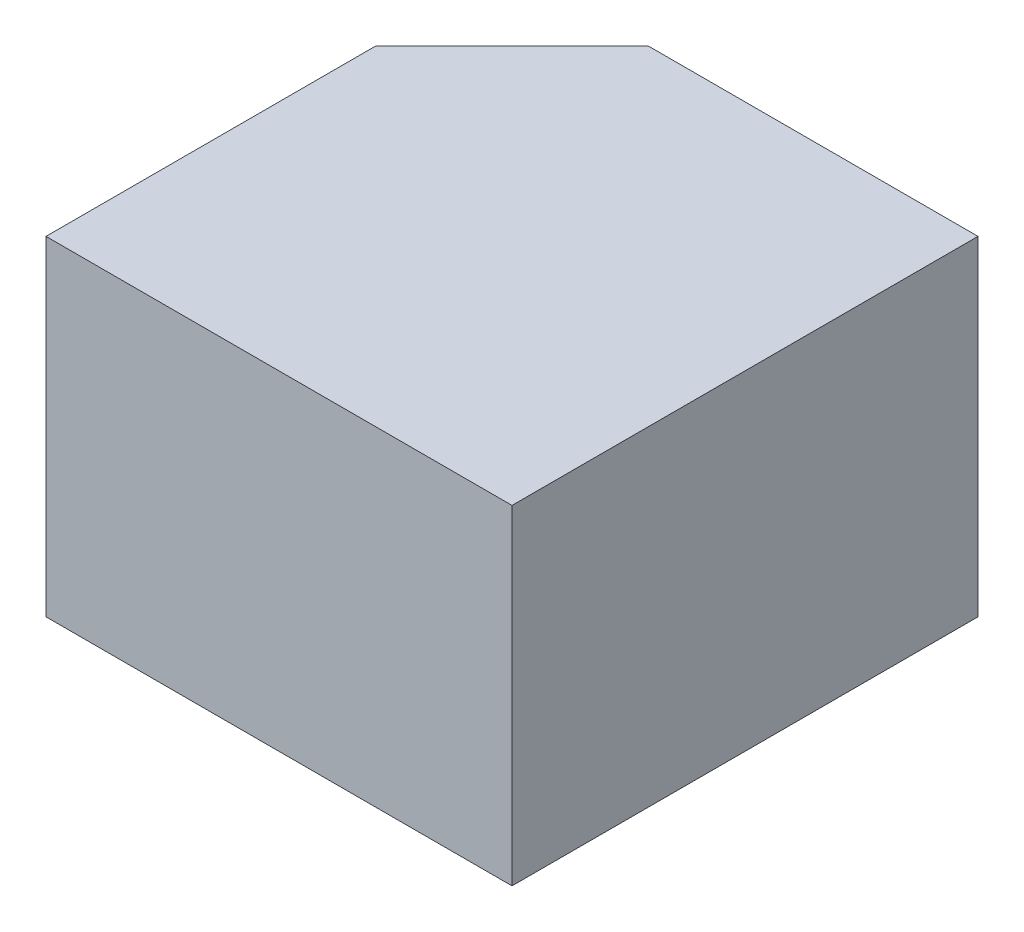
ISO-10303-21;
HEADER;
FILE_DESCRIPTION(('STEP AP214'),'2;1');
FILE_NAME('part.step','',(''),(''),'','','');
FILE_SCHEMA(('AUTOMOTIVE_DESIGN { 1 0 10303 214 1 1 1 1 }'));
ENDSEC;
DATA;
#1=APPLICATION_CONTEXT('core data for automotive mechanical design processes');
#2=APPLICATION_PROTOCOL_DEFINITION('international standard','automotive_design',2000,#1);
#3=PRODUCT_CONTEXT('',#1,'mechanical');
#4=PRODUCT('Part','Part','',(#3));
#5=PRODUCT_RELATED_PRODUCT_CATEGORY('part','',(#4));
#6=PRODUCT_DEFINITION_FORMATION('','',#4);
#7=PRODUCT_DEFINITION_CONTEXT('part definition',#1,'design');
#8=PRODUCT_DEFINITION('design','',#6,#7);
#9=PRODUCT_DEFINITION_SHAPE('','',#8);
#10=(LENGTH_UNIT() NAMED_UNIT(*) SI_UNIT(.MILLI.,.METRE.));
#11=(NAMED_UNIT(*) PLANE_ANGLE_UNIT() SI_UNIT($,.RADIAN.));
#12=(NAMED_UNIT(*) SI_UNIT($,.STERADIAN.) SOLID_ANGLE_UNIT());
#13=UNCERTAINTY_MEASURE_WITH_UNIT(LENGTH_MEASURE(1.E-05),#10,'distance_accuracy_value','');
#14=(GEOMETRIC_REPRESENTATION_CONTEXT(3) GLOBAL_UNCERTAINTY_ASSIGNED_CONTEXT((#13)) GLOBAL_UNIT_ASSIGNED_CONTEXT((#10,
#11,#12)) REPRESENTATION_CONTEXT('',''));
#15=CARTESIAN_POINT('',(0.,0.,0.));
#16=DIRECTION('',(0.,0.,1.));
#17=DIRECTION('',(1.,0.,0.));
#18=AXIS2_PLACEMENT_3D('',#15,#16,#17);
#19=CARTESIAN_POINT('',(21.2132034355964,30.,-21.2132034355964));
#20=DIRECTION('',(0.,0.,1.));
#21=DIRECTION('',(1.,0.,0.));
#22=AXIS2_PLACEMENT_3D('',#19,#20,#21);
#23=PLANE('',#22);
#24=DIRECTION('',(0.,-1.,0.));
#25=VECTOR('',#24,1.);
#26=CARTESIAN_POINT('',(-8.78679656440358,30.,-21.2132034355964));
#27=LINE('',#26,#25);
#28=CARTESIAN_POINT('',(-8.78679656440358,30.,-21.2132034355964));
#29=VERTEX_POINT('',#28);
#30=CARTESIAN_POINT('',(-8.78679656440357,0.,-21.2132034355964));
#31=VERTEX_POINT('',#30);
#32=EDGE_CURVE('E60',#29,#31,#27,.T.);
#33=ORIENTED_EDGE('',*,*,#32,.F.);
#34=DIRECTION('',(-1.,0.,0.));
#35=VECTOR('',#34,1.);
#36=CARTESIAN_POINT('',(21.2132034355964,30.,-21.2132034355964));
#37=LINE('',#36,#35);
#38=CARTESIAN_POINT('',(21.2132034355964,30.,-21.2132034355964));
#39=VERTEX_POINT('',#38);
#40=EDGE_CURVE('E112',#39,#29,#37,.T.);
#41=ORIENTED_EDGE('',*,*,#40,.F.);
#42=DIRECTION('',(0.,-1.,0.));
#43=VECTOR('',#42,1.);
#44=CARTESIAN_POINT('',(21.2132034355964,30.,-21.2132034355964));
#45=LINE('',#44,#43);
#46=CARTESIAN_POINT('',(21.2132034355964,0.,-21.2132034355964));
#47=VERTEX_POINT('',#46);
#48=EDGE_CURVE('E126',#39,#47,#45,.T.);
#49=ORIENTED_EDGE('',*,*,#48,.T.);
#50=DIRECTION('',(-1.,0.,0.));
#51=VECTOR('',#50,1.);
#52=CARTESIAN_POINT('',(21.2132034355964,0.,-21.2132034355964));
#53=LINE('',#52,#51);
#54=EDGE_CURVE('E106',#47,#31,#53,.T.);
#55=ORIENTED_EDGE('',*,*,#54,.T.);
#56=EDGE_LOOP('',(#33,#41,#49,#55));
#57=FACE_BOUND('',#56,.T.);
#58=ADVANCED_FACE('F45',(#57),#23,.F.);
#59=CARTESIAN_POINT('',(-21.2132034355964,30.,21.2132034355964));
#60=DIRECTION('',(-1.,0.,0.));
#61=DIRECTION('',(0.,0.,1.));
#62=AXIS2_PLACEMENT_3D('',#59,#60,#61);
#63=PLANE('',#62);
#64=DIRECTION('',(0.,0.,-1.));
#65=VECTOR('',#64,1.);
#66=CARTESIAN_POINT('',(-21.2132034355964,30.,21.2132034355964));
#67=LINE('',#66,#65);
#68=CARTESIAN_POINT('',(-21.2132034355964,30.,21.2132034355964));
#69=VERTEX_POINT('',#68);
#70=CARTESIAN_POINT('',(-21.2132034355964,30.,-8.78679656440357));
#71=VERTEX_POINT('',#70);
#72=EDGE_CURVE('E109',#69,#71,#67,.T.);
#73=ORIENTED_EDGE('',*,*,#72,.T.);
#74=DIRECTION('',(0.,-1.,0.));
#75=VECTOR('',#74,1.);
#76=CARTESIAN_POINT('',(-21.2132034355964,30.,-8.78679656440357));
#77=LINE('',#76,#75);
#78=CARTESIAN_POINT('',(-21.2132034355964,0.,-8.78679656440357));
#79=VERTEX_POINT('',#78);
#80=EDGE_CURVE('E99',#71,#79,#77,.T.);
#81=ORIENTED_EDGE('',*,*,#80,.T.);
#82=DIRECTION('',(0.,0.,-1.));
#83=VECTOR('',#82,1.);
#84=CARTESIAN_POINT('',(-21.2132034355964,0.,21.2132034355964));
#85=LINE('',#84,#83);
#86=CARTESIAN_POINT('',(-21.2132034355964,0.,21.2132034355964));
#87=VERTEX_POINT('',#86);
#88=EDGE_CURVE('E130',#87,#79,#85,.T.);
#89=ORIENTED_EDGE('',*,*,#88,.F.);
#90=DIRECTION('',(0.,-1.,0.));
#91=VECTOR('',#90,1.);
#92=CARTESIAN_POINT('',(-21.2132034355964,30.,21.2132034355964));
#93=LINE('',#92,#91);
#94=EDGE_CURVE('E11',#69,#87,#93,.T.);
#95=ORIENTED_EDGE('',*,*,#94,.F.);
#96=EDGE_LOOP('',(#73,#81,#89,#95));
#97=FACE_BOUND('',#96,.T.);
#98=ADVANCED_FACE('F115',(#97),#63,.T.);
#99=CARTESIAN_POINT('',(0.,30.,0.));
#100=DIRECTION('',(0.,-1.,0.));
#101=DIRECTION('',(0.,0.,-1.));
#102=AXIS2_PLACEMENT_3D('',#99,#100,#101);
#103=PLANE('',#102);
#104=DIRECTION('',(0.707106781186547,0.,-0.707106781186548));
#105=VECTOR('',#104,1.);
#106=CARTESIAN_POINT('',(-21.2132034355964,30.,-8.78679656440357));
#107=LINE('',#106,#105);
#108=EDGE_CURVE('E102',#71,#29,#107,.T.);
#109=ORIENTED_EDGE('',*,*,#108,.F.);
#110=ORIENTED_EDGE('',*,*,#72,.F.);
#111=DIRECTION('',(-1.,0.,0.));
#112=VECTOR('',#111,1.);
#113=CARTESIAN_POINT('',(21.2132034355964,30.,21.2132034355964));
#114=LINE('',#113,#112);
#115=CARTESIAN_POINT('',(21.2132034355964,30.,21.2132034355964));
#116=VERTEX_POINT('',#115);
#117=EDGE_CURVE('E117',#116,#69,#114,.T.);
#118=ORIENTED_EDGE('',*,*,#117,.F.);
#119=DIRECTION('',(0.,0.,-1.));
#120=VECTOR('',#119,1.);
#121=CARTESIAN_POINT('',(21.2132034355964,30.,21.2132034355964));
#122=LINE('',#121,#120);
#123=EDGE_CURVE('E69',#116,#39,#122,.T.);
#124=ORIENTED_EDGE('',*,*,#123,.T.);
#125=ORIENTED_EDGE('',*,*,#40,.T.);
#126=EDGE_LOOP('',(#109,#110,#118,#124,#125));
#127=FACE_BOUND('',#126,.T.);
#128=ADVANCED_FACE('F108',(#127),#103,.F.);
#129=CARTESIAN_POINT('',(0.,0.,0.));
#130=DIRECTION('',(0.,-1.,0.));
#131=DIRECTION('',(0.,0.,-1.));
#132=AXIS2_PLACEMENT_3D('',#129,#130,#131);
#133=PLANE('',#132);
#134=ORIENTED_EDGE('',*,*,#88,.T.);
#135=DIRECTION('',(0.707106781186547,0.,-0.707106781186548));
#136=VECTOR('',#135,1.);
#137=CARTESIAN_POINT('',(-21.2132034355964,0.,-8.78679656440357));
#138=LINE('',#137,#136);
#139=EDGE_CURVE('E103',#79,#31,#138,.T.);
#140=ORIENTED_EDGE('',*,*,#139,.T.);
#141=ORIENTED_EDGE('',*,*,#54,.F.);
#142=DIRECTION('',(0.,0.,-1.));
#143=VECTOR('',#142,1.);
#144=CARTESIAN_POINT('',(21.2132034355964,0.,21.2132034355964));
#145=LINE('',#144,#143);
#146=CARTESIAN_POINT('',(21.2132034355964,0.,21.2132034355964));
#147=VERTEX_POINT('',#146);
#148=EDGE_CURVE('E85',#147,#47,#145,.T.);
#149=ORIENTED_EDGE('',*,*,#148,.F.);
#150=DIRECTION('',(-1.,0.,0.));
#151=VECTOR('',#150,1.);
#152=CARTESIAN_POINT('',(21.2132034355964,0.,21.2132034355964));
#153=LINE('',#152,#151);
#154=EDGE_CURVE('E133',#147,#87,#153,.T.);
#155=ORIENTED_EDGE('',*,*,#154,.T.);
#156=EDGE_LOOP('',(#134,#140,#141,#149,#155));
#157=FACE_BOUND('',#156,.T.);
#158=ADVANCED_FACE('F146',(#157),#133,.T.);
#159=CARTESIAN_POINT('',(21.2132034355964,30.,21.2132034355964));
#160=DIRECTION('',(0.,0.,1.));
#161=DIRECTION('',(1.,0.,0.));
#162=AXIS2_PLACEMENT_3D('',#159,#160,#161);
#163=PLANE('',#162);
#164=ORIENTED_EDGE('',*,*,#154,.F.);
#165=DIRECTION('',(0.,-1.,0.));
#166=VECTOR('',#165,1.);
#167=CARTESIAN_POINT('',(21.2132034355964,30.,21.2132034355964));
#168=LINE('',#167,#166);
#169=EDGE_CURVE('E53',#116,#147,#168,.T.);
#170=ORIENTED_EDGE('',*,*,#169,.F.);
#171=ORIENTED_EDGE('',*,*,#117,.T.);
#172=ORIENTED_EDGE('',*,*,#94,.T.);
#173=EDGE_LOOP('',(#164,#170,#171,#172));
#174=FACE_BOUND('',#173,.T.);
#175=ADVANCED_FACE('F147',(#174),#163,.T.);
#176=CARTESIAN_POINT('',(21.2132034355964,30.,21.2132034355964));
#177=DIRECTION('',(-1.,0.,0.));
#178=DIRECTION('',(0.,0.,1.));
#179=AXIS2_PLACEMENT_3D('',#176,#177,#178);
#180=PLANE('',#179);
#181=ORIENTED_EDGE('',*,*,#148,.T.);
#182=ORIENTED_EDGE('',*,*,#48,.F.);
#183=ORIENTED_EDGE('',*,*,#123,.F.);
#184=ORIENTED_EDGE('',*,*,#169,.T.);
#185=EDGE_LOOP('',(#181,#182,#183,#184));
#186=FACE_BOUND('',#185,.T.);
#187=ADVANCED_FACE('F141',(#186),#180,.F.);
#188=CARTESIAN_POINT('',(-21.2132034355964,30.,-8.78679656440357));
#189=DIRECTION('',(-0.707106781186548,0.,-0.707106781186547));
#190=DIRECTION('',(-0.707106781186547,0.,0.707106781186548));
#191=AXIS2_PLACEMENT_3D('',#188,#189,#190);
#192=PLANE('',#191);
#193=ORIENTED_EDGE('',*,*,#139,.F.);
#194=ORIENTED_EDGE('',*,*,#80,.F.);
#195=ORIENTED_EDGE('',*,*,#108,.T.);
#196=ORIENTED_EDGE('',*,*,#32,.T.);
#197=EDGE_LOOP('',(#193,#194,#195,#196));
#198=FACE_BOUND('',#197,.T.);
#199=ADVANCED_FACE('F101',(#198),#192,.T.);
#200=CLOSED_SHELL('',(#58,#98,#128,#158,#175,#187,#199));
#201=MANIFOLD_SOLID_BREP('B2',#200);
#202=ADVANCED_BREP_SHAPE_REPRESENTATION('',(#18,#201),#14);
#203=SHAPE_DEFINITION_REPRESENTATION(#9,#202);
ENDSEC;
END-ISO-10303-21;
